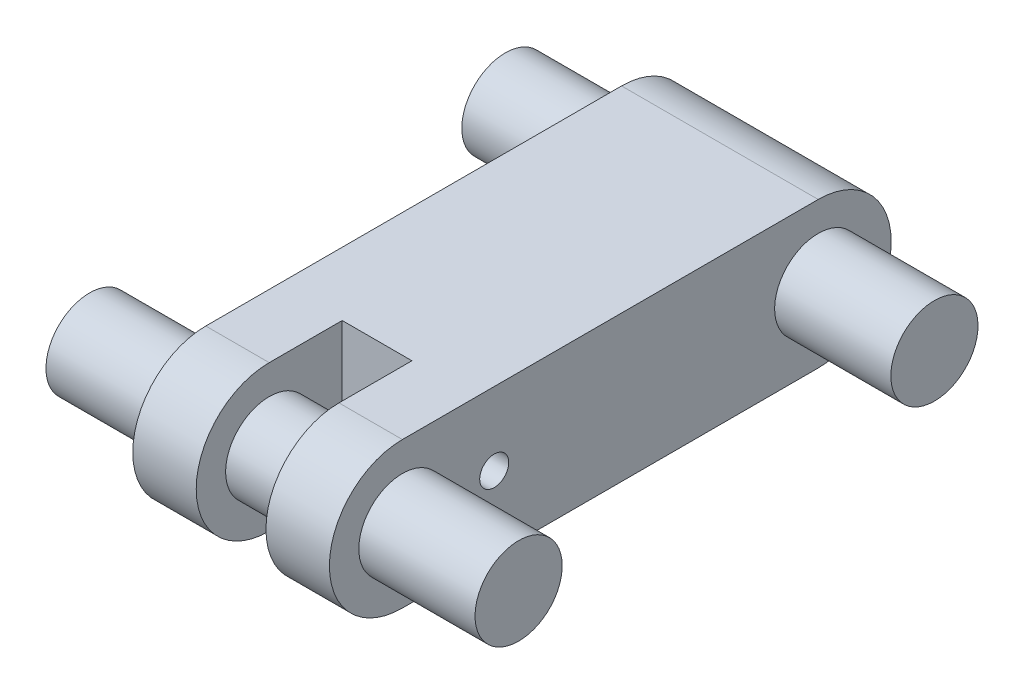
ISO-10303-21;
HEADER;
FILE_DESCRIPTION(('STEP AP214'),'2;1');
FILE_NAME('part.step','',(''),(''),'','','');
FILE_SCHEMA(('AUTOMOTIVE_DESIGN { 1 0 10303 214 1 1 1 1 }'));
ENDSEC;
DATA;
#1=APPLICATION_CONTEXT('core data for automotive mechanical design processes');
#2=APPLICATION_PROTOCOL_DEFINITION('international standard','automotive_design',2000,#1);
#3=PRODUCT_CONTEXT('',#1,'mechanical');
#4=PRODUCT('Part','Part','',(#3));
#5=PRODUCT_RELATED_PRODUCT_CATEGORY('part','',(#4));
#6=PRODUCT_DEFINITION_FORMATION('','',#4);
#7=PRODUCT_DEFINITION_CONTEXT('part definition',#1,'design');
#8=PRODUCT_DEFINITION('design','',#6,#7);
#9=PRODUCT_DEFINITION_SHAPE('','',#8);
#10=(LENGTH_UNIT() NAMED_UNIT(*) SI_UNIT(.MILLI.,.METRE.));
#11=(NAMED_UNIT(*) PLANE_ANGLE_UNIT() SI_UNIT($,.RADIAN.));
#12=(NAMED_UNIT(*) SI_UNIT($,.STERADIAN.) SOLID_ANGLE_UNIT());
#13=UNCERTAINTY_MEASURE_WITH_UNIT(LENGTH_MEASURE(1.E-05),#10,'distance_accuracy_value','');
#14=(GEOMETRIC_REPRESENTATION_CONTEXT(3) GLOBAL_UNCERTAINTY_ASSIGNED_CONTEXT((#13)) GLOBAL_UNIT_ASSIGNED_CONTEXT((#10,
#11,#12)) REPRESENTATION_CONTEXT('',''));
#15=CARTESIAN_POINT('',(0.,0.,0.));
#16=DIRECTION('',(0.,0.,1.));
#17=DIRECTION('',(1.,0.,0.));
#18=AXIS2_PLACEMENT_3D('',#15,#16,#17);
#19=CARTESIAN_POINT('',(171.048025075014,1.59872115546023E-11,-0.00224303629092759));
#20=DIRECTION('',(-0.999999999914018,0.,1.31134885782484E-05));
#21=DIRECTION('',(-1.48331175646733E-06,-0.993582080405297,-0.113113436404713));
#22=AXIS2_PLACEMENT_3D('',#19,#20,#21);
#23=CYLINDRICAL_SURFACE('',#22,125.622000000001);
#24=CARTESIAN_POINT('',(61.8480250362595,1.59872115546023E-11,-0.000811043337822781));
#25=DIRECTION('',(0.999999999914018,0.,-1.31134885840296E-05));
#26=DIRECTION('',(1.48331175712132E-06,0.993582080405297,0.113113436404713));
#27=AXIS2_PLACEMENT_3D('',#24,#25,#26);
#28=CIRCLE('',#27,125.622000000001);
#29=CARTESIAN_POINT('',(61.8480250362595,-125.621999999982,-0.000811043331161443));
#30=VERTEX_POINT('',#29);
#31=CARTESIAN_POINT('',(61.8480250362595,125.622000000019,-0.000811043340487316));
#32=VERTEX_POINT('',#31);
#33=EDGE_CURVE('E135',#30,#32,#28,.F.);
#34=ORIENTED_EDGE('',*,*,#33,.F.);
#35=DIRECTION('',(-0.999999999914018,0.,1.31134885782484E-05));
#36=VECTOR('',#35,1.);
#37=CARTESIAN_POINT('',(171.048025075014,-125.621999999986,-0.00224303629536848));
#38=LINE('',#37,#36);
#39=CARTESIAN_POINT('',(171.048025075014,-125.621999999986,-0.00224303629536848));
#40=VERTEX_POINT('',#39);
#41=EDGE_CURVE('E59',#40,#30,#38,.T.);
#42=ORIENTED_EDGE('',*,*,#41,.F.);
#43=CARTESIAN_POINT('',(171.048025075014,1.59872115546023E-11,-0.00224303629092759));
#44=DIRECTION('',(-0.999999999914018,0.,1.31134885782484E-05));
#45=DIRECTION('',(-1.48331175646731E-06,-0.993582080405296,-0.113113436404713));
#46=AXIS2_PLACEMENT_3D('',#43,#44,#45);
#47=CIRCLE('',#46,125.622000000001);
#48=CARTESIAN_POINT('',(171.048025075014,125.622000000019,-0.00224303630469436));
#49=VERTEX_POINT('',#48);
#50=EDGE_CURVE('E138',#40,#49,#47,.T.);
#51=ORIENTED_EDGE('',*,*,#50,.T.);
#52=DIRECTION('',(-0.999999999914018,0.,1.31134885782484E-05));
#53=VECTOR('',#52,1.);
#54=CARTESIAN_POINT('',(171.048025075014,125.622000000019,-0.00224303630469436));
#55=LINE('',#54,#53);
#56=EDGE_CURVE('E90',#49,#32,#55,.T.);
#57=ORIENTED_EDGE('',*,*,#56,.T.);
#58=EDGE_LOOP('',(#34,#42,#51,#57));
#59=FACE_BOUND('',#58,.T.);
#60=ADVANCED_FACE('F34',(#59),#23,.T.);
#61=CARTESIAN_POINT('',(-58.1519748571305,1.59872115546023E-11,0.000762575290025325));
#62=DIRECTION('',(-0.999999999914018,0.,1.31134885841594E-05));
#63=DIRECTION('',(-1.48331175713602E-06,-0.993582080405297,-0.113113436404713));
#64=AXIS2_PLACEMENT_3D('',#61,#62,#63);
#65=CIRCLE('',#64,125.622000000001);
#66=CARTESIAN_POINT('',(-58.1519748571305,125.622000000016,0.000762575299795287));
#67=VERTEX_POINT('',#66);
#68=CARTESIAN_POINT('',(-58.1519748571304,-125.62199999998,0.000762575309121161));
#69=VERTEX_POINT('',#68);
#70=EDGE_CURVE('E126',#67,#69,#65,.F.);
#71=ORIENTED_EDGE('',*,*,#70,.F.);
#72=CARTESIAN_POINT('',(-167.351974895888,125.622000000019,0.00219456823025155));
#73=VERTEX_POINT('',#72);
#74=EDGE_CURVE('E149',#67,#73,#55,.T.);
#75=ORIENTED_EDGE('',*,*,#74,.T.);
#76=CARTESIAN_POINT('',(-167.351974895888,1.77635683940025E-11,0.00219456824357422));
#77=DIRECTION('',(-0.999999999914018,0.,1.31134885782484E-05));
#78=DIRECTION('',(-1.48331175646731E-06,-0.993582080405296,-0.113113436404713));
#79=AXIS2_PLACEMENT_3D('',#76,#77,#78);
#80=CIRCLE('',#79,125.622000000001);
#81=CARTESIAN_POINT('',(-167.351974895888,-125.621999999984,0.00219456823957742));
#82=VERTEX_POINT('',#81);
#83=EDGE_CURVE('E137',#82,#73,#80,.T.);
#84=ORIENTED_EDGE('',*,*,#83,.F.);
#85=EDGE_CURVE('E82',#69,#82,#38,.T.);
#86=ORIENTED_EDGE('',*,*,#85,.F.);
#87=EDGE_LOOP('',(#71,#75,#84,#86));
#88=FACE_BOUND('',#87,.T.);
#89=ADVANCED_FACE('F36',(#88),#23,.T.);
#90=CARTESIAN_POINT('',(171.038640786399,-125.621999999986,-715.623304412171));
#91=DIRECTION('',(0.,-1.,0.));
#92=DIRECTION('',(1.30293277063315E-05,0.,-0.999999999915118));
#93=AXIS2_PLACEMENT_3D('',#90,#91,#92);
#94=PLANE('',#93);
#95=DIRECTION('',(1.31134885840292E-05,0.,0.999999999914018));
#96=VECTOR('',#95,1.);
#97=CARTESIAN_POINT('',(61.8463776935966,-125.621999999982,-125.622811032572));
#98=LINE('',#97,#96);
#99=CARTESIAN_POINT('',(61.8463776935966,-125.621999999982,-125.622811032572));
#100=VERTEX_POINT('',#99);
#101=EDGE_CURVE('E127',#100,#30,#98,.T.);
#102=ORIENTED_EDGE('',*,*,#101,.F.);
#103=DIRECTION('',(0.999999999914018,0.,-1.31134885904196E-05));
#104=VECTOR('',#103,1.);
#105=CARTESIAN_POINT('',(-58.1536221997934,-125.62199999998,-125.621237413942));
#106=LINE('',#105,#104);
#107=CARTESIAN_POINT('',(-58.1536221997934,-125.62199999998,-125.621237413942));
#108=VERTEX_POINT('',#107);
#109=EDGE_CURVE('E116',#108,#100,#106,.T.);
#110=ORIENTED_EDGE('',*,*,#109,.F.);
#111=DIRECTION('',(-1.3113488584159E-05,0.,-0.999999999914018));
#112=VECTOR('',#111,1.);
#113=CARTESIAN_POINT('',(-58.1494177268353,-125.62199999998,195.000764179707));
#114=LINE('',#113,#112);
#115=EDGE_CURVE('E123',#69,#108,#114,.T.);
#116=ORIENTED_EDGE('',*,*,#115,.F.);
#117=ORIENTED_EDGE('',*,*,#85,.T.);
#118=DIRECTION('',(1.31134885782291E-05,0.,0.999999999914018));
#119=VECTOR('',#118,1.);
#120=CARTESIAN_POINT('',(-167.361359184504,-125.621999999984,-715.618866807637));
#121=LINE('',#120,#119);
#122=CARTESIAN_POINT('',(-167.361359184504,-125.62199999998,-715.618866807637));
#123=VERTEX_POINT('',#122);
#124=EDGE_CURVE('E141',#123,#82,#121,.T.);
#125=ORIENTED_EDGE('',*,*,#124,.F.);
#126=DIRECTION('',(-0.999999999914018,0.,1.31134885782484E-05));
#127=VECTOR('',#126,1.);
#128=CARTESIAN_POINT('',(171.038640786399,-125.621999999982,-715.623304412171));
#129=LINE('',#128,#127);
#130=CARTESIAN_POINT('',(171.038640786399,-125.621999999982,-715.623304412171));
#131=VERTEX_POINT('',#130);
#132=EDGE_CURVE('E162',#131,#123,#129,.T.);
#133=ORIENTED_EDGE('',*,*,#132,.F.);
#134=DIRECTION('',(1.31134885782291E-05,0.,0.999999999914018));
#135=VECTOR('',#134,1.);
#136=CARTESIAN_POINT('',(171.038640786399,-125.621999999986,-715.623304412171));
#137=LINE('',#136,#135);
#138=EDGE_CURVE('E146',#131,#40,#137,.T.);
#139=ORIENTED_EDGE('',*,*,#138,.T.);
#140=ORIENTED_EDGE('',*,*,#41,.T.);
#141=EDGE_LOOP('',(#102,#110,#116,#117,#125,#133,#139,#140));
#142=FACE_BOUND('',#141,.T.);
#143=ADVANCED_FACE('F129',(#142),#94,.T.);
#144=CARTESIAN_POINT('',(171.038640786399,2.1316282072803E-11,-715.623304412172));
#145=DIRECTION('',(-0.999999999914018,0.,1.31134885782484E-05));
#146=DIRECTION('',(-1.48331175646733E-06,-0.993582080405297,-0.113113436404713));
#147=AXIS2_PLACEMENT_3D('',#144,#145,#146);
#148=CYLINDRICAL_SURFACE('',#147,125.622000000003);
#149=CARTESIAN_POINT('',(-167.361359184504,2.30926389122033E-11,-715.618866807637));
#150=DIRECTION('',(-0.999999999914018,0.,1.31134885782484E-05));
#151=DIRECTION('',(-1.48331175646731E-06,-0.993582080405296,-0.113113436404713));
#152=AXIS2_PLACEMENT_3D('',#149,#150,#151);
#153=CIRCLE('',#152,125.622000000003);
#154=CARTESIAN_POINT('',(-167.361359184504,125.622000000023,-715.618866807637));
#155=VERTEX_POINT('',#154);
#156=EDGE_CURVE('E155',#155,#123,#153,.T.);
#157=ORIENTED_EDGE('',*,*,#156,.F.);
#158=DIRECTION('',(-0.999999999914018,0.,1.31134885782484E-05));
#159=VECTOR('',#158,1.);
#160=CARTESIAN_POINT('',(171.038640786399,125.622000000023,-715.623304412171));
#161=LINE('',#160,#159);
#162=CARTESIAN_POINT('',(171.038640786399,125.622000000023,-715.623304412171));
#163=VERTEX_POINT('',#162);
#164=EDGE_CURVE('E164',#163,#155,#161,.T.);
#165=ORIENTED_EDGE('',*,*,#164,.F.);
#166=CARTESIAN_POINT('',(171.038640786399,2.1316282072803E-11,-715.623304412172));
#167=DIRECTION('',(-0.999999999914018,0.,1.31134885782484E-05));
#168=DIRECTION('',(-1.48331175646731E-06,-0.993582080405296,-0.113113436404713));
#169=AXIS2_PLACEMENT_3D('',#166,#167,#168);
#170=CIRCLE('',#169,125.622000000003);
#171=EDGE_CURVE('E143',#163,#131,#170,.T.);
#172=ORIENTED_EDGE('',*,*,#171,.T.);
#173=ORIENTED_EDGE('',*,*,#132,.T.);
#174=EDGE_LOOP('',(#157,#165,#172,#173));
#175=FACE_BOUND('',#174,.T.);
#176=ADVANCED_FACE('F191',(#175),#148,.T.);
#177=CARTESIAN_POINT('',(171.048025075014,125.622000000019,-0.00224303630469436));
#178=DIRECTION('',(0.,1.,0.));
#179=DIRECTION('',(-1.30293277063301E-05,0.,0.999999999915118));
#180=AXIS2_PLACEMENT_3D('',#177,#178,#179);
#181=PLANE('',#180);
#182=DIRECTION('',(-1.31134885840292E-05,0.,-0.999999999914018));
#183=VECTOR('',#182,1.);
#184=CARTESIAN_POINT('',(61.8480250362595,125.622000000019,-0.000811043351145457));
#185=LINE('',#184,#183);
#186=CARTESIAN_POINT('',(61.8463776935966,125.622000000016,-125.622811032572));
#187=VERTEX_POINT('',#186);
#188=EDGE_CURVE('E169',#32,#187,#185,.T.);
#189=ORIENTED_EDGE('',*,*,#188,.F.);
#190=ORIENTED_EDGE('',*,*,#56,.F.);
#191=DIRECTION('',(-1.31134885782696E-05,0.,-0.999999999914018));
#192=VECTOR('',#191,1.);
#193=CARTESIAN_POINT('',(171.048025075014,125.622000000019,-0.00224303630469436));
#194=LINE('',#193,#192);
#195=EDGE_CURVE('E140',#49,#163,#194,.T.);
#196=ORIENTED_EDGE('',*,*,#195,.T.);
#197=ORIENTED_EDGE('',*,*,#164,.T.);
#198=DIRECTION('',(-1.31134885782696E-05,0.,-0.999999999914018));
#199=VECTOR('',#198,1.);
#200=CARTESIAN_POINT('',(-167.351974895888,125.622000000019,0.00219456823025155));
#201=LINE('',#200,#199);
#202=EDGE_CURVE('E152',#73,#155,#201,.T.);
#203=ORIENTED_EDGE('',*,*,#202,.F.);
#204=ORIENTED_EDGE('',*,*,#74,.F.);
#205=DIRECTION('',(1.3113488584159E-05,0.,0.999999999914018));
#206=VECTOR('',#205,1.);
#207=CARTESIAN_POINT('',(-58.1519748571305,125.622000000016,0.000762575278034916));
#208=LINE('',#207,#206);
#209=CARTESIAN_POINT('',(-58.1536221997934,125.622000000019,-125.621237413942));
#210=VERTEX_POINT('',#209);
#211=EDGE_CURVE('E161',#210,#67,#208,.T.);
#212=ORIENTED_EDGE('',*,*,#211,.F.);
#213=DIRECTION('',(-0.999999999914018,0.,1.31134885904196E-05));
#214=VECTOR('',#213,1.);
#215=CARTESIAN_POINT('',(171.046377732351,125.622000000019,-125.624243025527));
#216=LINE('',#215,#214);
#217=EDGE_CURVE('E119',#187,#210,#216,.T.);
#218=ORIENTED_EDGE('',*,*,#217,.F.);
#219=EDGE_LOOP('',(#189,#190,#196,#197,#203,#204,#212,#218));
#220=FACE_BOUND('',#219,.T.);
#221=ADVANCED_FACE('F187',(#220),#181,.T.);
#222=CARTESIAN_POINT('',(171.048025075014,1.59872115546023E-11,-0.00224303629092759));
#223=DIRECTION('',(-0.999999999914018,0.,1.31134885782484E-05));
#224=DIRECTION('',(-1.48331175646731E-06,-0.993582080405296,-0.113113436404713));
#225=AXIS2_PLACEMENT_3D('',#222,#223,#224);
#226=PLANE('',#225);
#227=CARTESIAN_POINT('',(171.045952599053,0.,-158.043785425776));
#228=DIRECTION('',(-0.999999999914018,0.,1.31134885782484E-05));
#229=DIRECTION('',(1.31134885782484E-05,0.,0.999999999914018));
#230=AXIS2_PLACEMENT_3D('',#227,#228,#229);
#231=CIRCLE('',#230,25.);
#232=CARTESIAN_POINT('',(171.046280436268,0.,-133.043785427926));
#233=VERTEX_POINT('',#232);
#234=EDGE_CURVE('E220',#233,#233,#231,.T.);
#235=ORIENTED_EDGE('',*,*,#234,.T.);
#236=EDGE_LOOP('',(#235));
#237=FACE_BOUND('',#236,.T.);
#238=CARTESIAN_POINT('',(171.048025075018,1.24344978758018E-11,-0.00224303643170387));
#239=DIRECTION('',(-0.999999999914018,0.,1.31134892125453E-05));
#240=DIRECTION('',(-1.48331174758468E-06,-0.993582080405297,-0.113113436404713));
#241=AXIS2_PLACEMENT_3D('',#238,#239,#240);
#242=CIRCLE('',#241,74.9999999999992);
#243=CARTESIAN_POINT('',(171.047913826637,-74.5186560303841,-8.48575076678506));
#244=VERTEX_POINT('',#243);
#245=EDGE_CURVE('E211',#244,#244,#242,.T.);
#246=ORIENTED_EDGE('',*,*,#245,.T.);
#247=EDGE_LOOP('',(#246));
#248=FACE_BOUND('',#247,.T.);
#249=CARTESIAN_POINT('',(171.0386407864,1.4210854715202E-11,-715.6233044123));
#250=DIRECTION('',(-0.999999999914018,0.,1.31134892125453E-05));
#251=DIRECTION('',(-1.48331174758498E-06,-0.993582080405297,-0.113113436404713));
#252=AXIS2_PLACEMENT_3D('',#249,#250,#251);
#253=CIRCLE('',#252,74.9999999999992);
#254=CARTESIAN_POINT('',(171.038529538019,-74.5186560303823,-724.106812142653));
#255=VERTEX_POINT('',#254);
#256=EDGE_CURVE('E205',#255,#255,#253,.T.);
#257=ORIENTED_EDGE('',*,*,#256,.T.);
#258=EDGE_LOOP('',(#257));
#259=FACE_BOUND('',#258,.T.);
#260=ORIENTED_EDGE('',*,*,#50,.F.);
#261=ORIENTED_EDGE('',*,*,#138,.F.);
#262=ORIENTED_EDGE('',*,*,#171,.F.);
#263=ORIENTED_EDGE('',*,*,#195,.F.);
#264=EDGE_LOOP('',(#260,#261,#262,#263));
#265=FACE_BOUND('',#264,.T.);
#266=ADVANCED_FACE('F181',(#237,#248,#259,#265),#226,.F.);
#267=CARTESIAN_POINT('',(-167.351974895888,1.77635683940025E-11,0.00219456824357422));
#268=DIRECTION('',(-0.999999999914018,0.,1.31134885782484E-05));
#269=DIRECTION('',(-1.48331175646731E-06,-0.993582080405296,-0.113113436404713));
#270=AXIS2_PLACEMENT_3D('',#267,#268,#269);
#271=PLANE('',#270);
#272=CARTESIAN_POINT('',(-167.35404737185,0.,-158.039347821241));
#273=DIRECTION('',(-0.999999999914018,0.,1.31134885782484E-05));
#274=DIRECTION('',(1.31134885782484E-05,0.,0.999999999914018));
#275=AXIS2_PLACEMENT_3D('',#272,#273,#274);
#276=CIRCLE('',#275,25.);
#277=CARTESIAN_POINT('',(-167.353719534635,0.,-133.039347823391));
#278=VERTEX_POINT('',#277);
#279=EDGE_CURVE('E38',#278,#278,#276,.T.);
#280=ORIENTED_EDGE('',*,*,#279,.F.);
#281=EDGE_LOOP('',(#280));
#282=FACE_BOUND('',#281,.T.);
#283=CARTESIAN_POINT('',(-167.351974895888,-1.59872115546023E-11,0.00219456831729303));
#284=DIRECTION('',(-0.999999999914018,0.,1.31134885782484E-05));
#285=DIRECTION('',(-1.48331175646731E-06,-0.993582080405296,-0.113113436404713));
#286=AXIS2_PLACEMENT_3D('',#283,#284,#285);
#287=CIRCLE('',#286,74.9999999999992);
#288=CARTESIAN_POINT('',(-167.35208614427,-74.5186560304125,-8.48131316203606));
#289=VERTEX_POINT('',#288);
#290=EDGE_CURVE('E11',#289,#289,#287,.T.);
#291=ORIENTED_EDGE('',*,*,#290,.F.);
#292=EDGE_LOOP('',(#291));
#293=FACE_BOUND('',#292,.T.);
#294=CARTESIAN_POINT('',(-167.361359184504,-1.24344978758018E-11,-715.618866807551));
#295=DIRECTION('',(-0.999999999914018,0.,1.31134885782484E-05));
#296=DIRECTION('',(-1.48331175646731E-06,-0.993582080405296,-0.113113436404713));
#297=AXIS2_PLACEMENT_3D('',#294,#295,#296);
#298=CIRCLE('',#297,74.9999999999992);
#299=CARTESIAN_POINT('',(-167.361470432886,-74.5186560304089,-724.102374537904));
#300=VERTEX_POINT('',#299);
#301=EDGE_CURVE('E43',#300,#300,#298,.T.);
#302=ORIENTED_EDGE('',*,*,#301,.F.);
#303=EDGE_LOOP('',(#302));
#304=FACE_BOUND('',#303,.T.);
#305=ORIENTED_EDGE('',*,*,#83,.T.);
#306=ORIENTED_EDGE('',*,*,#202,.T.);
#307=ORIENTED_EDGE('',*,*,#156,.T.);
#308=ORIENTED_EDGE('',*,*,#124,.T.);
#309=EDGE_LOOP('',(#305,#306,#307,#308));
#310=FACE_BOUND('',#309,.T.);
#311=ADVANCED_FACE('F177',(#282,#293,#304,#310),#271,.T.);
#312=CARTESIAN_POINT('',(61.8463776935966,219.529863597932,-125.622811032572));
#313=DIRECTION('',(0.999999999914018,0.,-1.31134885840296E-05));
#314=DIRECTION('',(1.48331175712132E-06,0.993582080405297,0.113113436404713));
#315=AXIS2_PLACEMENT_3D('',#312,#313,#314);
#316=PLANE('',#315);
#317=CARTESIAN_POINT('',(61.8480250378968,3.97903932025656E-10,-0.000811043364468134));
#318=DIRECTION('',(-0.999999999914018,-5.94942411745942E-12,1.3113488545222E-05));
#319=DIRECTION('',(-1.48330584149019E-06,-0.993582080405297,-0.113113436404713));
#320=AXIS2_PLACEMENT_3D('',#317,#318,#319);
#321=CIRCLE('',#320,74.9999999999993);
#322=CARTESIAN_POINT('',(61.8479137899587,-74.5186560299987,-8.48431877371784));
#323=VERTEX_POINT('',#322);
#324=EDGE_CURVE('E197',#323,#323,#321,.T.);
#325=ORIENTED_EDGE('',*,*,#324,.F.);
#326=EDGE_LOOP('',(#325));
#327=FACE_BOUND('',#326,.T.);
#328=ORIENTED_EDGE('',*,*,#33,.T.);
#329=ORIENTED_EDGE('',*,*,#188,.T.);
#330=DIRECTION('',(0.,-1.,0.));
#331=VECTOR('',#330,1.);
#332=CARTESIAN_POINT('',(61.8463776935966,219.529863597932,-125.622811032572));
#333=LINE('',#332,#331);
#334=EDGE_CURVE('E121',#187,#100,#333,.T.);
#335=ORIENTED_EDGE('',*,*,#334,.T.);
#336=ORIENTED_EDGE('',*,*,#101,.T.);
#337=EDGE_LOOP('',(#328,#329,#335,#336));
#338=FACE_BOUND('',#337,.T.);
#339=ADVANCED_FACE('F180',(#327,#338),#316,.F.);
#340=CARTESIAN_POINT('',(-58.1536221997934,219.529863597932,-125.621237413942));
#341=DIRECTION('',(-1.31134885904192E-05,0.,-0.999999999914018));
#342=DIRECTION('',(-0.000229637026638492,0.999999973633418,3.01134241154077E-09));
#343=AXIS2_PLACEMENT_3D('',#340,#341,#342);
#344=PLANE('',#343);
#345=ORIENTED_EDGE('',*,*,#217,.T.);
#346=DIRECTION('',(0.,-1.,0.));
#347=VECTOR('',#346,1.);
#348=CARTESIAN_POINT('',(-58.1536221997934,219.529863597932,-125.621237413942));
#349=LINE('',#348,#347);
#350=EDGE_CURVE('E50',#210,#108,#349,.T.);
#351=ORIENTED_EDGE('',*,*,#350,.T.);
#352=ORIENTED_EDGE('',*,*,#109,.T.);
#353=ORIENTED_EDGE('',*,*,#334,.F.);
#354=EDGE_LOOP('',(#345,#351,#352,#353));
#355=FACE_BOUND('',#354,.T.);
#356=ADVANCED_FACE('F113',(#355),#344,.F.);
#357=CARTESIAN_POINT('',(-58.1494177268353,219.529863597932,195.000764179707));
#358=DIRECTION('',(-0.999999999914018,0.,1.31134885841594E-05));
#359=DIRECTION('',(-1.48331175713602E-06,-0.993582080405297,-0.113113436404713));
#360=AXIS2_PLACEMENT_3D('',#357,#358,#359);
#361=PLANE('',#360);
#362=CARTESIAN_POINT('',(-58.1519748578811,-3.17967874252645E-10,0.000762575259827258));
#363=DIRECTION('',(-0.999999999914018,-5.94942411745942E-12,1.3113488545222E-05));
#364=DIRECTION('',(-1.48330584149019E-06,-0.993582080405297,-0.113113436404713));
#365=AXIS2_PLACEMENT_3D('',#362,#363,#364);
#366=CIRCLE('',#365,75.0000000014186);
#367=CARTESIAN_POINT('',(-58.1520861058193,-74.5186560321248,-8.48274515525409));
#368=VERTEX_POINT('',#367);
#369=EDGE_CURVE('E195',#368,#368,#366,.T.);
#370=ORIENTED_EDGE('',*,*,#369,.T.);
#371=EDGE_LOOP('',(#370));
#372=FACE_BOUND('',#371,.T.);
#373=ORIENTED_EDGE('',*,*,#70,.T.);
#374=ORIENTED_EDGE('',*,*,#115,.T.);
#375=ORIENTED_EDGE('',*,*,#350,.F.);
#376=ORIENTED_EDGE('',*,*,#211,.T.);
#377=EDGE_LOOP('',(#373,#374,#375,#376));
#378=FACE_BOUND('',#377,.T.);
#379=ADVANCED_FACE('F124',(#372,#378),#361,.F.);
#380=CARTESIAN_POINT('',(61.84802503701,3.96127575186256E-10,-0.000811043364468134));
#381=DIRECTION('',(-0.999999999914018,-5.94942411745942E-12,1.3113488545222E-05));
#382=DIRECTION('',(-1.48330584149019E-06,-0.993582080405297,-0.113113436404713));
#383=AXIS2_PLACEMENT_3D('',#380,#381,#382);
#384=CYLINDRICAL_SURFACE('',#383,75.0000000007088);
#385=ORIENTED_EDGE('',*,*,#324,.T.);
#386=EDGE_LOOP('',(#385));
#387=FACE_BOUND('',#386,.T.);
#388=ORIENTED_EDGE('',*,*,#369,.F.);
#389=EDGE_LOOP('',(#388));
#390=FACE_BOUND('',#389,.T.);
#391=ADVANCED_FACE('F272',(#387,#390),#384,.T.);
#392=CARTESIAN_POINT('',(371.038630085879,3.01980662698043E-11,-715.625927110003));
#393=DIRECTION('',(-0.999999999914018,0.,1.31134892125453E-05));
#394=DIRECTION('',(-1.48331174758498E-06,-0.993582080405297,-0.113113436404713));
#395=AXIS2_PLACEMENT_3D('',#392,#393,#394);
#396=CYLINDRICAL_SURFACE('',#395,74.9999999999992);
#397=CARTESIAN_POINT('',(371.038640769202,3.01980662698043E-11,-715.625927110143));
#398=DIRECTION('',(-0.999999999914018,0.,1.31134892125453E-05));
#399=DIRECTION('',(-1.48331174758498E-06,-0.993582080405297,-0.113113436404713));
#400=AXIS2_PLACEMENT_3D('',#397,#398,#399);
#401=CIRCLE('',#400,74.9999999999992);
#402=CARTESIAN_POINT('',(371.038529520821,-74.5186560303663,-724.109434840496));
#403=VERTEX_POINT('',#402);
#404=EDGE_CURVE('E202',#403,#403,#401,.T.);
#405=ORIENTED_EDGE('',*,*,#404,.T.);
#406=EDGE_LOOP('',(#405));
#407=FACE_BOUND('',#406,.T.);
#408=ORIENTED_EDGE('',*,*,#256,.F.);
#409=EDGE_LOOP('',(#408));
#410=FACE_BOUND('',#409,.T.);
#411=ADVANCED_FACE('F278',(#407,#410),#396,.T.);
#412=CARTESIAN_POINT('',(371.038752017583,74.5186560304294,-707.14241937979));
#413=DIRECTION('',(0.999999999914018,0.,-1.31134892125453E-05));
#414=DIRECTION('',(1.48331174758498E-06,0.993582080405297,0.113113436404713));
#415=AXIS2_PLACEMENT_3D('',#412,#413,#414);
#416=PLANE('',#415);
#417=ORIENTED_EDGE('',*,*,#404,.F.);
#418=EDGE_LOOP('',(#417));
#419=FACE_BOUND('',#418,.T.);
#420=ADVANCED_FACE('F282',(#419),#416,.T.);
#421=CARTESIAN_POINT('',(371.048014374498,3.01980662698043E-11,-0.00486573413427394));
#422=DIRECTION('',(-0.999999999914018,0.,1.31134892125453E-05));
#423=DIRECTION('',(-1.48331174758468E-06,-0.993582080405297,-0.113113436404713));
#424=AXIS2_PLACEMENT_3D('',#421,#422,#423);
#425=CYLINDRICAL_SURFACE('',#424,74.9999999999992);
#426=CARTESIAN_POINT('',(371.048025057821,3.01980662698043E-11,-0.00486573427460613));
#427=DIRECTION('',(-0.999999999914018,0.,1.31134892125453E-05));
#428=DIRECTION('',(-1.48331174758468E-06,-0.993582080405297,-0.113113436404713));
#429=AXIS2_PLACEMENT_3D('',#426,#427,#428);
#430=CIRCLE('',#429,74.9999999999992);
#431=CARTESIAN_POINT('',(371.04791380944,-74.5186560303663,-8.48837346462796));
#432=VERTEX_POINT('',#431);
#433=EDGE_CURVE('E208',#432,#432,#430,.T.);
#434=ORIENTED_EDGE('',*,*,#433,.T.);
#435=EDGE_LOOP('',(#434));
#436=FACE_BOUND('',#435,.T.);
#437=ORIENTED_EDGE('',*,*,#245,.F.);
#438=EDGE_LOOP('',(#437));
#439=FACE_BOUND('',#438,.T.);
#440=ADVANCED_FACE('F286',(#436,#439),#425,.T.);
#441=CARTESIAN_POINT('',(371.048136306202,74.5186560304258,8.47864199607873));
#442=DIRECTION('',(0.999999999914018,0.,-1.31134892125453E-05));
#443=DIRECTION('',(1.48331174758468E-06,0.993582080405297,0.113113436404713));
#444=AXIS2_PLACEMENT_3D('',#441,#442,#443);
#445=PLANE('',#444);
#446=ORIENTED_EDGE('',*,*,#433,.F.);
#447=EDGE_LOOP('',(#446));
#448=FACE_BOUND('',#447,.T.);
#449=ADVANCED_FACE('F290',(#448),#445,.T.);
#450=CARTESIAN_POINT('',(-167.361369867826,-1.24344978758018E-11,-715.618866807411));
#451=DIRECTION('',(-0.999999999914018,0.,1.31134892157561E-05));
#452=DIRECTION('',(-1.48331175646603E-06,-0.993582080405297,-0.113113436404713));
#453=AXIS2_PLACEMENT_3D('',#450,#451,#452);
#454=CYLINDRICAL_SURFACE('',#453,74.9999999999992);
#455=ORIENTED_EDGE('',*,*,#301,.T.);
#456=EDGE_LOOP('',(#455));
#457=FACE_BOUND('',#456,.T.);
#458=CARTESIAN_POINT('',(-367.361359167308,-2.66453525910038E-11,-715.616244109708));
#459=DIRECTION('',(-0.999999999914018,0.,1.31134892157561E-05));
#460=DIRECTION('',(-1.48331175646603E-06,-0.993582080405297,-0.113113436404713));
#461=AXIS2_PLACEMENT_3D('',#458,#459,#460);
#462=CIRCLE('',#461,74.9999999999992);
#463=CARTESIAN_POINT('',(-367.361470415689,-74.5186560304231,-724.099751840061));
#464=VERTEX_POINT('',#463);
#465=EDGE_CURVE('E214',#464,#464,#462,.T.);
#466=ORIENTED_EDGE('',*,*,#465,.F.);
#467=EDGE_LOOP('',(#466));
#468=FACE_BOUND('',#467,.T.);
#469=ADVANCED_FACE('F174',(#457,#468),#454,.T.);
#470=CARTESIAN_POINT('',(-367.361359167308,-2.66453525910038E-11,-715.616244109708));
#471=DIRECTION('',(-0.999999999914018,0.,1.31134892157561E-05));
#472=DIRECTION('',(-1.48331175646603E-06,-0.993582080405297,-0.113113436404713));
#473=AXIS2_PLACEMENT_3D('',#470,#471,#472);
#474=PLANE('',#473);
#475=ORIENTED_EDGE('',*,*,#465,.T.);
#476=EDGE_LOOP('',(#475));
#477=FACE_BOUND('',#476,.T.);
#478=ADVANCED_FACE('F236',(#477),#474,.T.);
#479=CARTESIAN_POINT('',(-167.35198557921,-1.4210854715202E-11,0.00219456845718113));
#480=DIRECTION('',(-0.999999999914018,0.,1.3113489215756E-05));
#481=DIRECTION('',(-1.48331175646533E-06,-0.993582080405297,-0.113113436404713));
#482=AXIS2_PLACEMENT_3D('',#479,#480,#481);
#483=CYLINDRICAL_SURFACE('',#482,74.9999999999992);
#484=ORIENTED_EDGE('',*,*,#290,.T.);
#485=EDGE_LOOP('',(#484));
#486=FACE_BOUND('',#485,.T.);
#487=CARTESIAN_POINT('',(-367.351974878692,-3.01980662698043E-11,0.00481726616063938));
#488=DIRECTION('',(-0.999999999914018,0.,1.3113489215756E-05));
#489=DIRECTION('',(-1.48331175646533E-06,-0.993582080405297,-0.113113436404713));
#490=AXIS2_PLACEMENT_3D('',#487,#488,#489);
#491=CIRCLE('',#490,74.9999999999992);
#492=CARTESIAN_POINT('',(-367.352086127074,-74.5186560304267,-8.47869046419272));
#493=VERTEX_POINT('',#492);
#494=EDGE_CURVE('E217',#493,#493,#491,.T.);
#495=ORIENTED_EDGE('',*,*,#494,.F.);
#496=EDGE_LOOP('',(#495));
#497=FACE_BOUND('',#496,.T.);
#498=ADVANCED_FACE('F232',(#486,#497),#483,.T.);
#499=CARTESIAN_POINT('',(-367.351974878692,-3.01980662698043E-11,0.00481726616063938));
#500=DIRECTION('',(-0.999999999914018,0.,1.3113489215756E-05));
#501=DIRECTION('',(-1.48331175646533E-06,-0.993582080405297,-0.113113436404713));
#502=AXIS2_PLACEMENT_3D('',#499,#500,#501);
#503=PLANE('',#502);
#504=ORIENTED_EDGE('',*,*,#494,.T.);
#505=EDGE_LOOP('',(#504));
#506=FACE_BOUND('',#505,.T.);
#507=ADVANCED_FACE('F235',(#506),#503,.T.);
#508=CARTESIAN_POINT('',(-367.366062463228,0.,-158.036724965966));
#509=DIRECTION('',(0.999999999914018,0.,-1.31134885782484E-05));
#510=DIRECTION('',(-1.31134885782484E-05,0.,-0.999999999914018));
#511=AXIS2_PLACEMENT_3D('',#508,#509,#510);
#512=CYLINDRICAL_SURFACE('',#511,25.);
#513=ORIENTED_EDGE('',*,*,#279,.T.);
#514=EDGE_LOOP('',(#513));
#515=FACE_BOUND('',#514,.T.);
#516=ORIENTED_EDGE('',*,*,#234,.F.);
#517=EDGE_LOOP('',(#516));
#518=FACE_BOUND('',#517,.T.);
#519=ADVANCED_FACE('F227',(#515,#518),#512,.F.);
#520=CLOSED_SHELL('',(#60,#89,#143,#176,#221,#266,#311,#339,#356,#379,#391,#411,#420,#440,#449,
#469,#478,#498,#507,#519));
#521=MANIFOLD_SOLID_BREP('B2',#520);
#522=ADVANCED_BREP_SHAPE_REPRESENTATION('',(#18,#521),#14);
#523=SHAPE_DEFINITION_REPRESENTATION(#9,#522);
ENDSEC;
END-ISO-10303-21;
